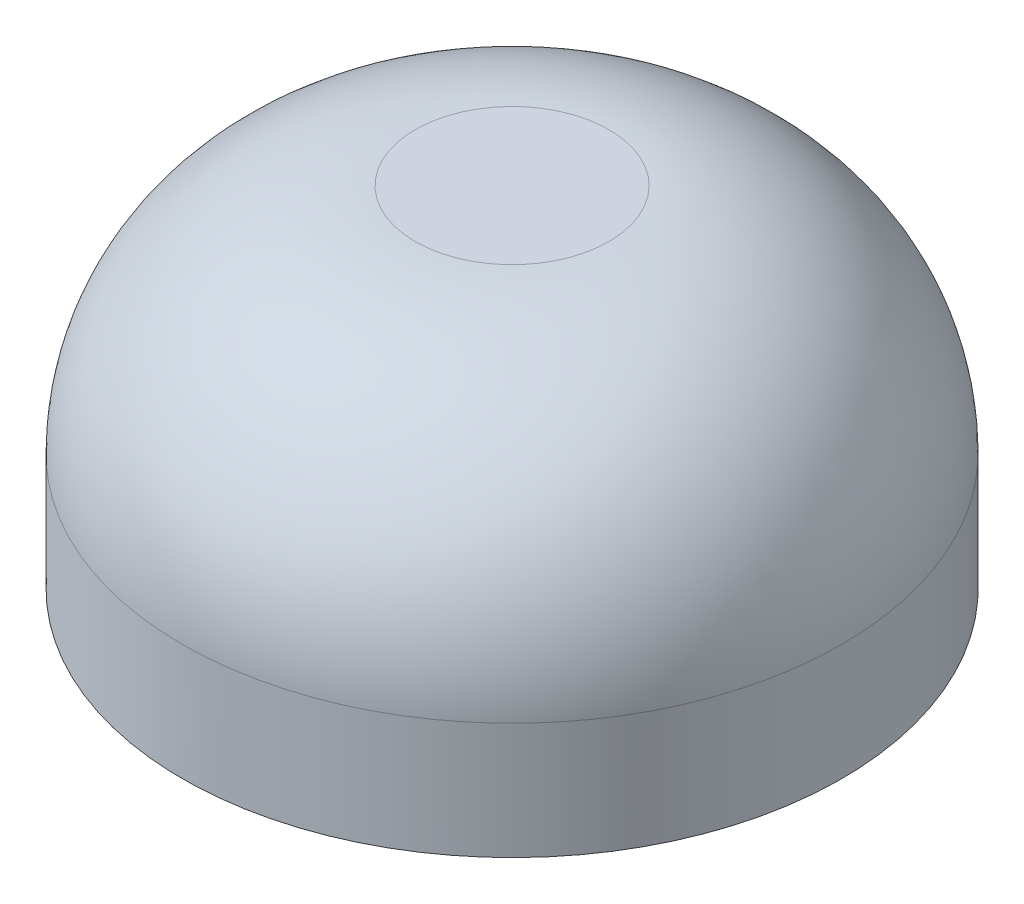
ISO-10303-21;
HEADER;
FILE_DESCRIPTION(('STEP AP214'),'2;1');
FILE_NAME('part.step','',(''),(''),'','','');
FILE_SCHEMA(('AUTOMOTIVE_DESIGN { 1 0 10303 214 1 1 1 1 }'));
ENDSEC;
DATA;
#1=APPLICATION_CONTEXT('core data for automotive mechanical design processes');
#2=APPLICATION_PROTOCOL_DEFINITION('international standard','automotive_design',2000,#1);
#3=PRODUCT_CONTEXT('',#1,'mechanical');
#4=PRODUCT('Part','Part','',(#3));
#5=PRODUCT_RELATED_PRODUCT_CATEGORY('part','',(#4));
#6=PRODUCT_DEFINITION_FORMATION('','',#4);
#7=PRODUCT_DEFINITION_CONTEXT('part definition',#1,'design');
#8=PRODUCT_DEFINITION('design','',#6,#7);
#9=PRODUCT_DEFINITION_SHAPE('','',#8);
#10=(LENGTH_UNIT() NAMED_UNIT(*) SI_UNIT(.MILLI.,.METRE.));
#11=(NAMED_UNIT(*) PLANE_ANGLE_UNIT() SI_UNIT($,.RADIAN.));
#12=(NAMED_UNIT(*) SI_UNIT($,.STERADIAN.) SOLID_ANGLE_UNIT());
#13=UNCERTAINTY_MEASURE_WITH_UNIT(LENGTH_MEASURE(1.E-05),#10,'distance_accuracy_value','');
#14=(GEOMETRIC_REPRESENTATION_CONTEXT(3) GLOBAL_UNCERTAINTY_ASSIGNED_CONTEXT((#13)) GLOBAL_UNIT_ASSIGNED_CONTEXT((#10,
#11,#12)) REPRESENTATION_CONTEXT('',''));
#15=CARTESIAN_POINT('',(0.,0.,0.));
#16=DIRECTION('',(0.,0.,1.));
#17=DIRECTION('',(1.,0.,0.));
#18=AXIS2_PLACEMENT_3D('',#15,#16,#17);
#19=CARTESIAN_POINT('',(0.,200.,0.));
#20=DIRECTION('',(0.,-1.,0.));
#21=DIRECTION('',(0.,0.,-1.));
#22=AXIS2_PLACEMENT_3D('',#19,#20,#21);
#23=CYLINDRICAL_SURFACE('',#22,85.);
#24=CARTESIAN_POINT('',(0.,140.,0.));
#25=DIRECTION('',(0.,1.,0.));
#26=DIRECTION('',(0.,0.,1.));
#27=AXIS2_PLACEMENT_3D('',#24,#25,#26);
#28=CIRCLE('',#27,85.);
#29=CARTESIAN_POINT('',(0.,140.,-85.));
#30=VERTEX_POINT('',#29);
#31=EDGE_CURVE('E10',#30,#30,#28,.F.);
#32=CARTESIAN_POINT('',(0.,110.,0.));
#33=DIRECTION('',(0.,1.,0.));
#34=DIRECTION('',(0.,0.,1.));
#35=AXIS2_PLACEMENT_3D('',#32,#33,#34);
#36=CIRCLE('',#35,85.);
#37=CARTESIAN_POINT('',(0.,110.,-85.));
#38=VERTEX_POINT('',#37);
#39=EDGE_CURVE('E42',#38,#38,#36,.T.);
#40=CARTESIAN_POINT('',(0.,140.,-85.));
#41=CARTESIAN_POINT('',(0.,139.6875,-85.));
#42=CARTESIAN_POINT('',(0.,139.375,-85.));
#43=CARTESIAN_POINT('',(0.,138.75,-85.));
#44=CARTESIAN_POINT('',(0.,138.4375,-85.));
#45=CARTESIAN_POINT('',(0.,137.8125,-85.));
#46=CARTESIAN_POINT('',(0.,137.5,-85.));
#47=CARTESIAN_POINT('',(0.,136.875,-85.));
#48=CARTESIAN_POINT('',(0.,136.5625,-85.));
#49=CARTESIAN_POINT('',(0.,135.9375,-85.));
#50=CARTESIAN_POINT('',(0.,135.625,-85.));
#51=CARTESIAN_POINT('',(0.,135.,-85.));
#52=CARTESIAN_POINT('',(0.,134.6875,-85.));
#53=CARTESIAN_POINT('',(0.,134.0625,-85.));
#54=CARTESIAN_POINT('',(0.,133.75,-85.));
#55=CARTESIAN_POINT('',(0.,133.125,-85.));
#56=CARTESIAN_POINT('',(0.,132.8125,-85.));
#57=CARTESIAN_POINT('',(0.,132.1875,-85.));
#58=CARTESIAN_POINT('',(0.,131.875,-85.));
#59=CARTESIAN_POINT('',(0.,131.25,-85.));
#60=CARTESIAN_POINT('',(0.,130.9375,-85.));
#61=CARTESIAN_POINT('',(0.,130.3125,-85.));
#62=CARTESIAN_POINT('',(0.,130.,-85.));
#63=CARTESIAN_POINT('',(0.,129.375,-85.));
#64=CARTESIAN_POINT('',(0.,129.0625,-85.));
#65=CARTESIAN_POINT('',(0.,128.4375,-85.));
#66=CARTESIAN_POINT('',(0.,128.125,-85.));
#67=CARTESIAN_POINT('',(0.,127.5,-85.));
#68=CARTESIAN_POINT('',(0.,127.1875,-85.));
#69=CARTESIAN_POINT('',(0.,126.5625,-85.));
#70=CARTESIAN_POINT('',(0.,126.25,-85.));
#71=CARTESIAN_POINT('',(0.,125.625,-85.));
#72=CARTESIAN_POINT('',(0.,125.3125,-85.));
#73=CARTESIAN_POINT('',(0.,124.6875,-85.));
#74=CARTESIAN_POINT('',(0.,124.375,-85.));
#75=CARTESIAN_POINT('',(0.,123.75,-85.));
#76=CARTESIAN_POINT('',(0.,123.4375,-85.));
#77=CARTESIAN_POINT('',(0.,122.8125,-85.));
#78=CARTESIAN_POINT('',(0.,122.5,-85.));
#79=CARTESIAN_POINT('',(0.,121.875,-85.));
#80=CARTESIAN_POINT('',(0.,121.5625,-85.));
#81=CARTESIAN_POINT('',(0.,120.9375,-85.));
#82=CARTESIAN_POINT('',(0.,120.625,-85.));
#83=CARTESIAN_POINT('',(0.,120.,-85.));
#84=CARTESIAN_POINT('',(0.,119.6875,-85.));
#85=CARTESIAN_POINT('',(0.,119.0625,-85.));
#86=CARTESIAN_POINT('',(0.,118.75,-85.));
#87=CARTESIAN_POINT('',(0.,118.125,-85.));
#88=CARTESIAN_POINT('',(0.,117.8125,-85.));
#89=CARTESIAN_POINT('',(0.,117.1875,-85.));
#90=CARTESIAN_POINT('',(0.,116.875,-85.));
#91=CARTESIAN_POINT('',(0.,116.25,-85.));
#92=CARTESIAN_POINT('',(0.,115.9375,-85.));
#93=CARTESIAN_POINT('',(0.,115.3125,-85.));
#94=CARTESIAN_POINT('',(0.,115.,-85.));
#95=CARTESIAN_POINT('',(0.,114.375,-85.));
#96=CARTESIAN_POINT('',(0.,114.0625,-85.));
#97=CARTESIAN_POINT('',(0.,113.4375,-85.));
#98=CARTESIAN_POINT('',(0.,113.125,-85.));
#99=CARTESIAN_POINT('',(0.,112.5,-85.));
#100=CARTESIAN_POINT('',(0.,112.1875,-85.));
#101=CARTESIAN_POINT('',(0.,111.5625,-85.));
#102=CARTESIAN_POINT('',(0.,111.25,-85.));
#103=CARTESIAN_POINT('',(0.,110.625,-85.));
#104=CARTESIAN_POINT('',(0.,110.3125,-85.));
#105=CARTESIAN_POINT('',(0.,110.,-85.));
#106=B_SPLINE_CURVE_WITH_KNOTS('',3,(#40,#41,#42,#43,#44,#45,#46,#47,#48,#49,#50,#51,#52,#53,
#54,#55,#56,#57,#58,#59,#60,#61,#62,#63,#64,#65,#66,#67,#68,#69,#70,#71,#72,#73,#74,#75,#76,#77,
#78,#79,#80,#81,#82,#83,#84,#85,#86,#87,#88,#89,#90,#91,#92,#93,#94,#95,#96,#97,#98,#99,#100,
#101,#102,#103,#104,#105),.UNSPECIFIED.,.F.,.F.,(4,2,2,2,2,2,2,2,2,2,2,2,2,2,2,2,2,2,2,2,2,2,2,
2,2,2,2,2,2,2,2,2,4),(0.,0.937500000000008,1.87499999999999,2.81249999999997,3.75,
4.68749999999998,5.62499999999999,6.5625,7.49999999999998,8.43749999999999,9.37499999999999,
10.3125,11.25,12.1875,13.125,14.0625,15.,15.9375,16.875,17.8125,18.75,19.6875,20.625,21.5625,
22.5,23.4375,24.375,25.3125,26.25,27.1875,28.125,29.0625,30.),.UNSPECIFIED.);
#107=EDGE_CURVE('BSEAM31',#30,#38,#106,.T.);
#108=ORIENTED_EDGE('',*,*,#31,.T.);
#109=ORIENTED_EDGE('',*,*,#39,.T.);
#110=ORIENTED_EDGE('',*,*,#107,.T.);
#111=ORIENTED_EDGE('',*,*,#107,.F.);
#112=EDGE_LOOP('',(#108,#110,#109,#111));
#113=FACE_BOUND('',#112,.T.);
#114=ADVANCED_FACE('F31',(#113),#23,.T.);
#115=CARTESIAN_POINT('',(0.,200.,0.));
#116=DIRECTION('',(0.,1.,0.));
#117=DIRECTION('',(0.,0.,1.));
#118=AXIS2_PLACEMENT_3D('',#115,#116,#117);
#119=PLANE('',#118);
#120=CARTESIAN_POINT('',(0.,200.,0.));
#121=DIRECTION('',(0.,1.,0.));
#122=DIRECTION('',(0.,0.,1.));
#123=AXIS2_PLACEMENT_3D('',#120,#121,#122);
#124=CIRCLE('',#123,25.);
#125=CARTESIAN_POINT('',(0.,200.,25.));
#126=VERTEX_POINT('',#125);
#127=EDGE_CURVE('E38',#126,#126,#124,.T.);
#128=ORIENTED_EDGE('',*,*,#127,.T.);
#129=EDGE_LOOP('',(#128));
#130=FACE_BOUND('',#129,.T.);
#131=ADVANCED_FACE('F52',(#130),#119,.T.);
#132=CARTESIAN_POINT('',(0.,110.,0.));
#133=DIRECTION('',(0.,1.,0.));
#134=DIRECTION('',(0.,0.,1.));
#135=AXIS2_PLACEMENT_3D('',#132,#133,#134);
#136=PLANE('',#135);
#137=ORIENTED_EDGE('',*,*,#39,.F.);
#138=EDGE_LOOP('',(#137));
#139=FACE_BOUND('',#138,.T.);
#140=ADVANCED_FACE('F50',(#139),#136,.F.);
#141=CARTESIAN_POINT('',(0.,140.,0.));
#142=DIRECTION('',(0.,1.,0.));
#143=DIRECTION('',(0.,0.,1.));
#144=AXIS2_PLACEMENT_3D('',#141,#142,#143);
#145=DEGENERATE_TOROIDAL_SURFACE('',#144,25.,60.,.T.);
#146=ORIENTED_EDGE('',*,*,#31,.F.);
#147=EDGE_LOOP('',(#146));
#148=FACE_BOUND('',#147,.T.);
#149=ORIENTED_EDGE('',*,*,#127,.F.);
#150=EDGE_LOOP('',(#149));
#151=FACE_BOUND('',#150,.T.);
#152=ADVANCED_FACE('F33',(#148,#151),#145,.T.);
#153=CLOSED_SHELL('',(#114,#131,#140,#152));
#154=MANIFOLD_SOLID_BREP('B2',#153);
#155=ADVANCED_BREP_SHAPE_REPRESENTATION('',(#18,#154),#14);
#156=SHAPE_DEFINITION_REPRESENTATION(#9,#155);
ENDSEC;
END-ISO-10303-21;
